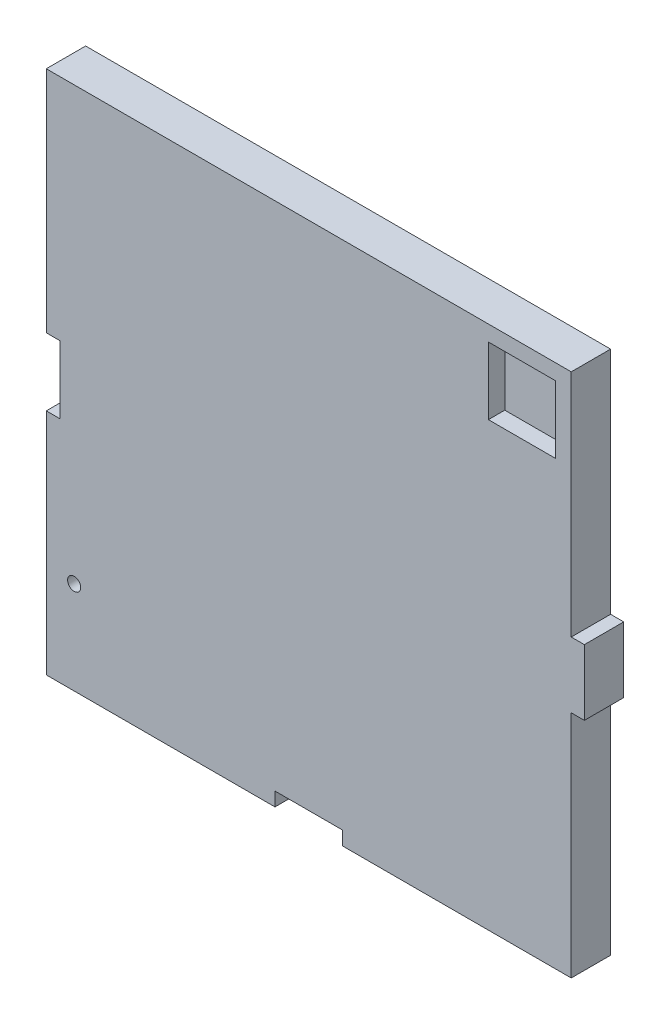
ISO-10303-21;
HEADER;
FILE_DESCRIPTION(('STEP AP214'),'2;1');
FILE_NAME('part.step','',(''),(''),'','','');
FILE_SCHEMA(('AUTOMOTIVE_DESIGN { 1 0 10303 214 1 1 1 1 }'));
ENDSEC;
DATA;
#1=APPLICATION_CONTEXT('core data for automotive mechanical design processes');
#2=APPLICATION_PROTOCOL_DEFINITION('international standard','automotive_design',2000,#1);
#3=PRODUCT_CONTEXT('',#1,'mechanical');
#4=PRODUCT('Part','Part','',(#3));
#5=PRODUCT_RELATED_PRODUCT_CATEGORY('part','',(#4));
#6=PRODUCT_DEFINITION_FORMATION('','',#4);
#7=PRODUCT_DEFINITION_CONTEXT('part definition',#1,'design');
#8=PRODUCT_DEFINITION('design','',#6,#7);
#9=PRODUCT_DEFINITION_SHAPE('','',#8);
#10=(LENGTH_UNIT() NAMED_UNIT(*) SI_UNIT(.MILLI.,.METRE.));
#11=(NAMED_UNIT(*) PLANE_ANGLE_UNIT() SI_UNIT($,.RADIAN.));
#12=(NAMED_UNIT(*) SI_UNIT($,.STERADIAN.) SOLID_ANGLE_UNIT());
#13=UNCERTAINTY_MEASURE_WITH_UNIT(LENGTH_MEASURE(1.E-05),#10,'distance_accuracy_value','');
#14=(GEOMETRIC_REPRESENTATION_CONTEXT(3) GLOBAL_UNCERTAINTY_ASSIGNED_CONTEXT((#13)) GLOBAL_UNIT_ASSIGNED_CONTEXT((#10,
#11,#12)) REPRESENTATION_CONTEXT('',''));
#15=CARTESIAN_POINT('',(0.,0.,0.));
#16=DIRECTION('',(0.,0.,1.));
#17=DIRECTION('',(1.,0.,0.));
#18=AXIS2_PLACEMENT_3D('',#15,#16,#17);
#19=CARTESIAN_POINT('',(8.50000000002301,28.2999999999935,12.));
#20=DIRECTION('',(0.,0.,-1.));
#21=DIRECTION('',(-1.,0.,0.));
#22=AXIS2_PLACEMENT_3D('',#19,#20,#21);
#23=CYLINDRICAL_SURFACE('',#22,2.);
#24=CARTESIAN_POINT('',(8.50000000002301,28.2999999999935,12.));
#25=DIRECTION('',(0.,0.,1.));
#26=DIRECTION('',(1.,0.,0.));
#27=AXIS2_PLACEMENT_3D('',#24,#25,#26);
#28=CIRCLE('',#27,2.);
#29=CARTESIAN_POINT('',(10.500000000023,28.2999999999935,12.));
#30=VERTEX_POINT('',#29);
#31=EDGE_CURVE('E205',#30,#30,#28,.T.);
#32=ORIENTED_EDGE('',*,*,#31,.T.);
#33=EDGE_LOOP('',(#32));
#34=FACE_BOUND('',#33,.T.);
#35=CARTESIAN_POINT('',(8.50000000002301,28.2999999999935,8.));
#36=DIRECTION('',(0.,0.,-1.));
#37=DIRECTION('',(-1.,0.,0.));
#38=AXIS2_PLACEMENT_3D('',#35,#36,#37);
#39=CIRCLE('',#38,2.);
#40=CARTESIAN_POINT('',(6.50000000002301,28.2999999999935,8.));
#41=VERTEX_POINT('',#40);
#42=EDGE_CURVE('E43',#41,#41,#39,.T.);
#43=ORIENTED_EDGE('',*,*,#42,.T.);
#44=EDGE_LOOP('',(#43));
#45=FACE_BOUND('',#44,.T.);
#46=ADVANCED_FACE('F39',(#34,#45),#23,.F.);
#47=CARTESIAN_POINT('',(0.,0.,12.));
#48=DIRECTION('',(0.,0.,1.));
#49=DIRECTION('',(1.,0.,0.));
#50=AXIS2_PLACEMENT_3D('',#47,#48,#49);
#51=PLANE('',#50);
#52=DIRECTION('',(0.,-1.,0.));
#53=VECTOR('',#52,1.);
#54=CARTESIAN_POINT('',(134.75,155.25,12.));
#55=LINE('',#54,#53);
#56=CARTESIAN_POINT('',(134.75,155.25,12.));
#57=VERTEX_POINT('',#56);
#58=CARTESIAN_POINT('',(134.75,134.75,12.));
#59=VERTEX_POINT('',#58);
#60=EDGE_CURVE('E54',#57,#59,#55,.T.);
#61=ORIENTED_EDGE('',*,*,#60,.F.);
#62=DIRECTION('',(-1.,0.,0.));
#63=VECTOR('',#62,1.);
#64=CARTESIAN_POINT('',(155.25,155.25,12.));
#65=LINE('',#64,#63);
#66=CARTESIAN_POINT('',(155.25,155.25,12.));
#67=VERTEX_POINT('',#66);
#68=EDGE_CURVE('E333',#67,#57,#65,.T.);
#69=ORIENTED_EDGE('',*,*,#68,.F.);
#70=DIRECTION('',(0.,1.,0.));
#71=VECTOR('',#70,1.);
#72=CARTESIAN_POINT('',(155.25,134.75,12.));
#73=LINE('',#72,#71);
#74=CARTESIAN_POINT('',(155.25,134.75,12.));
#75=VERTEX_POINT('',#74);
#76=EDGE_CURVE('E340',#75,#67,#73,.T.);
#77=ORIENTED_EDGE('',*,*,#76,.F.);
#78=DIRECTION('',(1.,0.,0.));
#79=VECTOR('',#78,1.);
#80=CARTESIAN_POINT('',(134.75,134.75,12.));
#81=LINE('',#80,#79);
#82=EDGE_CURVE('E344',#59,#75,#81,.T.);
#83=ORIENTED_EDGE('',*,*,#82,.F.);
#84=EDGE_LOOP('',(#61,#69,#77,#83));
#85=FACE_BOUND('',#84,.T.);
#86=DIRECTION('',(0.,-1.,0.));
#87=VECTOR('',#86,1.);
#88=CARTESIAN_POINT('',(0.,69.7,12.));
#89=LINE('',#88,#87);
#90=CARTESIAN_POINT('',(0.,69.7,12.));
#91=VERTEX_POINT('',#90);
#92=CARTESIAN_POINT('',(0.,0.,12.));
#93=VERTEX_POINT('',#92);
#94=EDGE_CURVE('E233',#91,#93,#89,.T.);
#95=ORIENTED_EDGE('',*,*,#94,.T.);
#96=DIRECTION('',(1.,0.,0.));
#97=VECTOR('',#96,1.);
#98=CARTESIAN_POINT('',(0.,0.,12.));
#99=LINE('',#98,#97);
#100=CARTESIAN_POINT('',(69.7,0.,12.));
#101=VERTEX_POINT('',#100);
#102=EDGE_CURVE('E129',#93,#101,#99,.T.);
#103=ORIENTED_EDGE('',*,*,#102,.T.);
#104=DIRECTION('',(0.,1.,0.));
#105=VECTOR('',#104,1.);
#106=CARTESIAN_POINT('',(69.7,0.,12.));
#107=LINE('',#106,#105);
#108=CARTESIAN_POINT('',(69.7,4.2,12.));
#109=VERTEX_POINT('',#108);
#110=EDGE_CURVE('E271',#101,#109,#107,.T.);
#111=ORIENTED_EDGE('',*,*,#110,.T.);
#112=DIRECTION('',(1.,0.,0.));
#113=VECTOR('',#112,1.);
#114=CARTESIAN_POINT('',(69.7,4.2,12.));
#115=LINE('',#114,#113);
#116=CARTESIAN_POINT('',(90.3,4.2,12.));
#117=VERTEX_POINT('',#116);
#118=EDGE_CURVE('E290',#109,#117,#115,.T.);
#119=ORIENTED_EDGE('',*,*,#118,.T.);
#120=DIRECTION('',(0.,-1.,0.));
#121=VECTOR('',#120,1.);
#122=CARTESIAN_POINT('',(90.3,4.2,12.));
#123=LINE('',#122,#121);
#124=CARTESIAN_POINT('',(90.3,0.,12.));
#125=VERTEX_POINT('',#124);
#126=EDGE_CURVE('E288',#117,#125,#123,.T.);
#127=ORIENTED_EDGE('',*,*,#126,.T.);
#128=DIRECTION('',(1.,0.,0.));
#129=VECTOR('',#128,1.);
#130=CARTESIAN_POINT('',(90.3,0.,12.));
#131=LINE('',#130,#129);
#132=CARTESIAN_POINT('',(160.,0.,12.));
#133=VERTEX_POINT('',#132);
#134=EDGE_CURVE('E287',#125,#133,#131,.T.);
#135=ORIENTED_EDGE('',*,*,#134,.T.);
#136=DIRECTION('',(0.,1.,0.));
#137=VECTOR('',#136,1.);
#138=CARTESIAN_POINT('',(160.,0.,12.));
#139=LINE('',#138,#137);
#140=CARTESIAN_POINT('',(160.,70.,12.));
#141=VERTEX_POINT('',#140);
#142=EDGE_CURVE('E292',#133,#141,#139,.T.);
#143=ORIENTED_EDGE('',*,*,#142,.T.);
#144=DIRECTION('',(1.,0.,0.));
#145=VECTOR('',#144,1.);
#146=CARTESIAN_POINT('',(160.,70.,12.));
#147=LINE('',#146,#145);
#148=CARTESIAN_POINT('',(164.,70.,12.));
#149=VERTEX_POINT('',#148);
#150=EDGE_CURVE('E299',#141,#149,#147,.T.);
#151=ORIENTED_EDGE('',*,*,#150,.T.);
#152=DIRECTION('',(0.,1.,0.));
#153=VECTOR('',#152,1.);
#154=CARTESIAN_POINT('',(164.,70.,12.));
#155=LINE('',#154,#153);
#156=CARTESIAN_POINT('',(164.,90.,12.));
#157=VERTEX_POINT('',#156);
#158=EDGE_CURVE('E300',#149,#157,#155,.T.);
#159=ORIENTED_EDGE('',*,*,#158,.T.);
#160=DIRECTION('',(-1.,0.,0.));
#161=VECTOR('',#160,1.);
#162=CARTESIAN_POINT('',(164.,90.,12.));
#163=LINE('',#162,#161);
#164=CARTESIAN_POINT('',(160.,90.,12.));
#165=VERTEX_POINT('',#164);
#166=EDGE_CURVE('E303',#157,#165,#163,.T.);
#167=ORIENTED_EDGE('',*,*,#166,.T.);
#168=DIRECTION('',(0.,1.,0.));
#169=VECTOR('',#168,1.);
#170=CARTESIAN_POINT('',(160.,90.,12.));
#171=LINE('',#170,#169);
#172=CARTESIAN_POINT('',(160.,160.,12.));
#173=VERTEX_POINT('',#172);
#174=EDGE_CURVE('E302',#165,#173,#171,.T.);
#175=ORIENTED_EDGE('',*,*,#174,.T.);
#176=DIRECTION('',(-1.,0.,0.));
#177=VECTOR('',#176,1.);
#178=CARTESIAN_POINT('',(160.,160.,12.));
#179=LINE('',#178,#177);
#180=CARTESIAN_POINT('',(0.,160.,12.));
#181=VERTEX_POINT('',#180);
#182=EDGE_CURVE('E301',#173,#181,#179,.T.);
#183=ORIENTED_EDGE('',*,*,#182,.T.);
#184=DIRECTION('',(0.,-1.,0.));
#185=VECTOR('',#184,1.);
#186=CARTESIAN_POINT('',(0.,160.,12.));
#187=LINE('',#186,#185);
#188=CARTESIAN_POINT('',(0.,90.3,12.));
#189=VERTEX_POINT('',#188);
#190=EDGE_CURVE('E179',#181,#189,#187,.T.);
#191=ORIENTED_EDGE('',*,*,#190,.T.);
#192=DIRECTION('',(1.,0.,0.));
#193=VECTOR('',#192,1.);
#194=CARTESIAN_POINT('',(0.,90.3,12.));
#195=LINE('',#194,#193);
#196=CARTESIAN_POINT('',(4.2,90.3,12.));
#197=VERTEX_POINT('',#196);
#198=EDGE_CURVE('E166',#189,#197,#195,.T.);
#199=ORIENTED_EDGE('',*,*,#198,.T.);
#200=DIRECTION('',(0.,-1.,0.));
#201=VECTOR('',#200,1.);
#202=CARTESIAN_POINT('',(4.2,90.3,12.));
#203=LINE('',#202,#201);
#204=CARTESIAN_POINT('',(4.2,69.7,12.));
#205=VERTEX_POINT('',#204);
#206=EDGE_CURVE('E175',#197,#205,#203,.T.);
#207=ORIENTED_EDGE('',*,*,#206,.T.);
#208=DIRECTION('',(-1.,0.,0.));
#209=VECTOR('',#208,1.);
#210=CARTESIAN_POINT('',(4.2,69.7,12.));
#211=LINE('',#210,#209);
#212=EDGE_CURVE('E65',#205,#91,#211,.T.);
#213=ORIENTED_EDGE('',*,*,#212,.T.);
#214=EDGE_LOOP('',(#95,#103,#111,#119,#127,#135,#143,#151,#159,#167,#175,#183,#191,#199,#207,#213));
#215=FACE_BOUND('',#214,.T.);
#216=ORIENTED_EDGE('',*,*,#31,.F.);
#217=EDGE_LOOP('',(#216));
#218=FACE_BOUND('',#217,.T.);
#219=ADVANCED_FACE('F173',(#85,#215,#218),#51,.T.);
#220=CARTESIAN_POINT('',(0.,0.,0.));
#221=DIRECTION('',(0.,0.,1.));
#222=DIRECTION('',(1.,0.,0.));
#223=AXIS2_PLACEMENT_3D('',#220,#221,#222);
#224=PLANE('',#223);
#225=CARTESIAN_POINT('',(8.50000000002301,28.2999999999935,0.));
#226=DIRECTION('',(0.,0.,-1.));
#227=DIRECTION('',(-1.,0.,0.));
#228=AXIS2_PLACEMENT_3D('',#225,#226,#227);
#229=CIRCLE('',#228,3.45);
#230=CARTESIAN_POINT('',(5.05000000002301,28.2999999999935,0.));
#231=VERTEX_POINT('',#230);
#232=EDGE_CURVE('E358',#231,#231,#229,.T.);
#233=ORIENTED_EDGE('',*,*,#232,.F.);
#234=EDGE_LOOP('',(#233));
#235=FACE_BOUND('',#234,.T.);
#236=DIRECTION('',(0.,-1.,0.));
#237=VECTOR('',#236,1.);
#238=CARTESIAN_POINT('',(0.,69.7,0.));
#239=LINE('',#238,#237);
#240=CARTESIAN_POINT('',(0.,69.7,0.));
#241=VERTEX_POINT('',#240);
#242=CARTESIAN_POINT('',(0.,0.,0.));
#243=VERTEX_POINT('',#242);
#244=EDGE_CURVE('E196',#241,#243,#239,.T.);
#245=ORIENTED_EDGE('',*,*,#244,.F.);
#246=DIRECTION('',(-1.,0.,0.));
#247=VECTOR('',#246,1.);
#248=CARTESIAN_POINT('',(4.2,69.7,0.));
#249=LINE('',#248,#247);
#250=CARTESIAN_POINT('',(4.2,69.7,0.));
#251=VERTEX_POINT('',#250);
#252=EDGE_CURVE('E123',#251,#241,#249,.T.);
#253=ORIENTED_EDGE('',*,*,#252,.F.);
#254=DIRECTION('',(0.,-1.,0.));
#255=VECTOR('',#254,1.);
#256=CARTESIAN_POINT('',(4.2,90.3,0.));
#257=LINE('',#256,#255);
#258=CARTESIAN_POINT('',(4.2,90.3,0.));
#259=VERTEX_POINT('',#258);
#260=EDGE_CURVE('E227',#259,#251,#257,.T.);
#261=ORIENTED_EDGE('',*,*,#260,.F.);
#262=DIRECTION('',(1.,0.,0.));
#263=VECTOR('',#262,1.);
#264=CARTESIAN_POINT('',(0.,90.3,0.));
#265=LINE('',#264,#263);
#266=CARTESIAN_POINT('',(0.,90.3,0.));
#267=VERTEX_POINT('',#266);
#268=EDGE_CURVE('E188',#267,#259,#265,.T.);
#269=ORIENTED_EDGE('',*,*,#268,.F.);
#270=DIRECTION('',(0.,-1.,0.));
#271=VECTOR('',#270,1.);
#272=CARTESIAN_POINT('',(0.,160.,0.));
#273=LINE('',#272,#271);
#274=CARTESIAN_POINT('',(0.,160.,0.));
#275=VERTEX_POINT('',#274);
#276=EDGE_CURVE('E223',#275,#267,#273,.T.);
#277=ORIENTED_EDGE('',*,*,#276,.F.);
#278=DIRECTION('',(-1.,0.,0.));
#279=VECTOR('',#278,1.);
#280=CARTESIAN_POINT('',(70.,160.,0.));
#281=LINE('',#280,#279);
#282=CARTESIAN_POINT('',(160.,160.,0.));
#283=VERTEX_POINT('',#282);
#284=EDGE_CURVE('E224',#283,#275,#281,.T.);
#285=ORIENTED_EDGE('',*,*,#284,.F.);
#286=DIRECTION('',(0.,1.,0.));
#287=VECTOR('',#286,1.);
#288=CARTESIAN_POINT('',(160.,90.,0.));
#289=LINE('',#288,#287);
#290=CARTESIAN_POINT('',(160.,90.,0.));
#291=VERTEX_POINT('',#290);
#292=EDGE_CURVE('E219',#291,#283,#289,.T.);
#293=ORIENTED_EDGE('',*,*,#292,.F.);
#294=DIRECTION('',(-1.,0.,0.));
#295=VECTOR('',#294,1.);
#296=CARTESIAN_POINT('',(164.,90.,0.));
#297=LINE('',#296,#295);
#298=CARTESIAN_POINT('',(164.,90.,0.));
#299=VERTEX_POINT('',#298);
#300=EDGE_CURVE('E217',#299,#291,#297,.T.);
#301=ORIENTED_EDGE('',*,*,#300,.F.);
#302=DIRECTION('',(0.,1.,0.));
#303=VECTOR('',#302,1.);
#304=CARTESIAN_POINT('',(164.,70.,0.));
#305=LINE('',#304,#303);
#306=CARTESIAN_POINT('',(164.,70.,0.));
#307=VERTEX_POINT('',#306);
#308=EDGE_CURVE('E216',#307,#299,#305,.T.);
#309=ORIENTED_EDGE('',*,*,#308,.F.);
#310=DIRECTION('',(1.,0.,0.));
#311=VECTOR('',#310,1.);
#312=CARTESIAN_POINT('',(160.,70.,0.));
#313=LINE('',#312,#311);
#314=CARTESIAN_POINT('',(160.,70.,0.));
#315=VERTEX_POINT('',#314);
#316=EDGE_CURVE('E212',#315,#307,#313,.T.);
#317=ORIENTED_EDGE('',*,*,#316,.F.);
#318=DIRECTION('',(0.,1.,0.));
#319=VECTOR('',#318,1.);
#320=CARTESIAN_POINT('',(160.,0.,0.));
#321=LINE('',#320,#319);
#322=CARTESIAN_POINT('',(160.,0.,0.));
#323=VERTEX_POINT('',#322);
#324=EDGE_CURVE('E215',#323,#315,#321,.T.);
#325=ORIENTED_EDGE('',*,*,#324,.F.);
#326=DIRECTION('',(1.,0.,0.));
#327=VECTOR('',#326,1.);
#328=CARTESIAN_POINT('',(90.3,0.,0.));
#329=LINE('',#328,#327);
#330=CARTESIAN_POINT('',(90.3,0.,0.));
#331=VERTEX_POINT('',#330);
#332=EDGE_CURVE('E209',#331,#323,#329,.T.);
#333=ORIENTED_EDGE('',*,*,#332,.F.);
#334=DIRECTION('',(0.,-1.,0.));
#335=VECTOR('',#334,1.);
#336=CARTESIAN_POINT('',(90.3,4.2,0.));
#337=LINE('',#336,#335);
#338=CARTESIAN_POINT('',(90.3,4.2,0.));
#339=VERTEX_POINT('',#338);
#340=EDGE_CURVE('E208',#339,#331,#337,.T.);
#341=ORIENTED_EDGE('',*,*,#340,.F.);
#342=DIRECTION('',(1.,0.,0.));
#343=VECTOR('',#342,1.);
#344=CARTESIAN_POINT('',(69.7,4.2,0.));
#345=LINE('',#344,#343);
#346=CARTESIAN_POINT('',(69.7,4.2,0.));
#347=VERTEX_POINT('',#346);
#348=EDGE_CURVE('E206',#347,#339,#345,.T.);
#349=ORIENTED_EDGE('',*,*,#348,.F.);
#350=DIRECTION('',(0.,1.,0.));
#351=VECTOR('',#350,1.);
#352=CARTESIAN_POINT('',(69.7,0.,0.));
#353=LINE('',#352,#351);
#354=CARTESIAN_POINT('',(69.7,0.,0.));
#355=VERTEX_POINT('',#354);
#356=EDGE_CURVE('E204',#355,#347,#353,.T.);
#357=ORIENTED_EDGE('',*,*,#356,.F.);
#358=DIRECTION('',(1.,0.,0.));
#359=VECTOR('',#358,1.);
#360=CARTESIAN_POINT('',(0.,0.,0.));
#361=LINE('',#360,#359);
#362=EDGE_CURVE('E203',#243,#355,#361,.T.);
#363=ORIENTED_EDGE('',*,*,#362,.F.);
#364=EDGE_LOOP('',(#245,#253,#261,#269,#277,#285,#293,#301,#309,#317,#325,#333,#341,#349,#357,#363));
#365=FACE_BOUND('',#364,.T.);
#366=ADVANCED_FACE('F274',(#235,#365),#224,.F.);
#367=CARTESIAN_POINT('',(0.,69.7,12.));
#368=DIRECTION('',(1.,0.,0.));
#369=DIRECTION('',(0.,0.,-1.));
#370=AXIS2_PLACEMENT_3D('',#367,#368,#369);
#371=PLANE('',#370);
#372=ORIENTED_EDGE('',*,*,#244,.T.);
#373=DIRECTION('',(0.,0.,-1.));
#374=VECTOR('',#373,1.);
#375=CARTESIAN_POINT('',(0.,0.,12.));
#376=LINE('',#375,#374);
#377=EDGE_CURVE('E11',#93,#243,#376,.T.);
#378=ORIENTED_EDGE('',*,*,#377,.F.);
#379=ORIENTED_EDGE('',*,*,#94,.F.);
#380=DIRECTION('',(0.,0.,-1.));
#381=VECTOR('',#380,1.);
#382=CARTESIAN_POINT('',(0.,69.7,12.));
#383=LINE('',#382,#381);
#384=EDGE_CURVE('E195',#91,#241,#383,.T.);
#385=ORIENTED_EDGE('',*,*,#384,.T.);
#386=EDGE_LOOP('',(#372,#378,#379,#385));
#387=FACE_BOUND('',#386,.T.);
#388=ADVANCED_FACE('F41',(#387),#371,.F.);
#389=CARTESIAN_POINT('',(0.,0.,12.));
#390=DIRECTION('',(0.,1.,0.));
#391=DIRECTION('',(0.,0.,1.));
#392=AXIS2_PLACEMENT_3D('',#389,#390,#391);
#393=PLANE('',#392);
#394=ORIENTED_EDGE('',*,*,#362,.T.);
#395=DIRECTION('',(0.,0.,-1.));
#396=VECTOR('',#395,1.);
#397=CARTESIAN_POINT('',(69.7,0.,12.));
#398=LINE('',#397,#396);
#399=EDGE_CURVE('E48',#101,#355,#398,.T.);
#400=ORIENTED_EDGE('',*,*,#399,.F.);
#401=ORIENTED_EDGE('',*,*,#102,.F.);
#402=ORIENTED_EDGE('',*,*,#377,.T.);
#403=EDGE_LOOP('',(#394,#400,#401,#402));
#404=FACE_BOUND('',#403,.T.);
#405=ADVANCED_FACE('F435',(#404),#393,.F.);
#406=CARTESIAN_POINT('',(69.7,0.,12.));
#407=DIRECTION('',(-1.,0.,0.));
#408=DIRECTION('',(0.,0.,1.));
#409=AXIS2_PLACEMENT_3D('',#406,#407,#408);
#410=PLANE('',#409);
#411=ORIENTED_EDGE('',*,*,#356,.T.);
#412=DIRECTION('',(0.,0.,-1.));
#413=VECTOR('',#412,1.);
#414=CARTESIAN_POINT('',(69.7,4.2,12.));
#415=LINE('',#414,#413);
#416=EDGE_CURVE('E265',#109,#347,#415,.T.);
#417=ORIENTED_EDGE('',*,*,#416,.F.);
#418=ORIENTED_EDGE('',*,*,#110,.F.);
#419=ORIENTED_EDGE('',*,*,#399,.T.);
#420=EDGE_LOOP('',(#411,#417,#418,#419));
#421=FACE_BOUND('',#420,.T.);
#422=ADVANCED_FACE('F267',(#421),#410,.F.);
#423=CARTESIAN_POINT('',(69.7,4.2,12.));
#424=DIRECTION('',(0.,1.,0.));
#425=DIRECTION('',(0.,0.,1.));
#426=AXIS2_PLACEMENT_3D('',#423,#424,#425);
#427=PLANE('',#426);
#428=ORIENTED_EDGE('',*,*,#348,.T.);
#429=DIRECTION('',(0.,0.,-1.));
#430=VECTOR('',#429,1.);
#431=CARTESIAN_POINT('',(90.3,4.2,12.));
#432=LINE('',#431,#430);
#433=EDGE_CURVE('E259',#117,#339,#432,.T.);
#434=ORIENTED_EDGE('',*,*,#433,.F.);
#435=ORIENTED_EDGE('',*,*,#118,.F.);
#436=ORIENTED_EDGE('',*,*,#416,.T.);
#437=EDGE_LOOP('',(#428,#434,#435,#436));
#438=FACE_BOUND('',#437,.T.);
#439=ADVANCED_FACE('F278',(#438),#427,.F.);
#440=CARTESIAN_POINT('',(90.3,4.2,12.));
#441=DIRECTION('',(1.,0.,0.));
#442=DIRECTION('',(0.,0.,-1.));
#443=AXIS2_PLACEMENT_3D('',#440,#441,#442);
#444=PLANE('',#443);
#445=ORIENTED_EDGE('',*,*,#340,.T.);
#446=DIRECTION('',(0.,0.,-1.));
#447=VECTOR('',#446,1.);
#448=CARTESIAN_POINT('',(90.3,0.,12.));
#449=LINE('',#448,#447);
#450=EDGE_CURVE('E258',#125,#331,#449,.T.);
#451=ORIENTED_EDGE('',*,*,#450,.F.);
#452=ORIENTED_EDGE('',*,*,#126,.F.);
#453=ORIENTED_EDGE('',*,*,#433,.T.);
#454=EDGE_LOOP('',(#445,#451,#452,#453));
#455=FACE_BOUND('',#454,.T.);
#456=ADVANCED_FACE('F285',(#455),#444,.F.);
#457=CARTESIAN_POINT('',(90.3,0.,12.));
#458=DIRECTION('',(0.,1.,0.));
#459=DIRECTION('',(0.,0.,1.));
#460=AXIS2_PLACEMENT_3D('',#457,#458,#459);
#461=PLANE('',#460);
#462=ORIENTED_EDGE('',*,*,#332,.T.);
#463=DIRECTION('',(0.,0.,-1.));
#464=VECTOR('',#463,1.);
#465=CARTESIAN_POINT('',(160.,0.,12.));
#466=LINE('',#465,#464);
#467=EDGE_CURVE('E251',#133,#323,#466,.T.);
#468=ORIENTED_EDGE('',*,*,#467,.F.);
#469=ORIENTED_EDGE('',*,*,#134,.F.);
#470=ORIENTED_EDGE('',*,*,#450,.T.);
#471=EDGE_LOOP('',(#462,#468,#469,#470));
#472=FACE_BOUND('',#471,.T.);
#473=ADVANCED_FACE('F425',(#472),#461,.F.);
#474=CARTESIAN_POINT('',(160.,0.,12.));
#475=DIRECTION('',(-1.,0.,0.));
#476=DIRECTION('',(0.,0.,1.));
#477=AXIS2_PLACEMENT_3D('',#474,#475,#476);
#478=PLANE('',#477);
#479=ORIENTED_EDGE('',*,*,#324,.T.);
#480=DIRECTION('',(0.,0.,-1.));
#481=VECTOR('',#480,1.);
#482=CARTESIAN_POINT('',(160.,70.,12.));
#483=LINE('',#482,#481);
#484=EDGE_CURVE('E246',#141,#315,#483,.T.);
#485=ORIENTED_EDGE('',*,*,#484,.F.);
#486=ORIENTED_EDGE('',*,*,#142,.F.);
#487=ORIENTED_EDGE('',*,*,#467,.T.);
#488=EDGE_LOOP('',(#479,#485,#486,#487));
#489=FACE_BOUND('',#488,.T.);
#490=ADVANCED_FACE('F416',(#489),#478,.F.);
#491=CARTESIAN_POINT('',(160.,70.,12.));
#492=DIRECTION('',(0.,1.,0.));
#493=DIRECTION('',(0.,0.,1.));
#494=AXIS2_PLACEMENT_3D('',#491,#492,#493);
#495=PLANE('',#494);
#496=ORIENTED_EDGE('',*,*,#316,.T.);
#497=DIRECTION('',(0.,0.,-1.));
#498=VECTOR('',#497,1.);
#499=CARTESIAN_POINT('',(164.,70.,12.));
#500=LINE('',#499,#498);
#501=EDGE_CURVE('E249',#149,#307,#500,.T.);
#502=ORIENTED_EDGE('',*,*,#501,.F.);
#503=ORIENTED_EDGE('',*,*,#150,.F.);
#504=ORIENTED_EDGE('',*,*,#484,.T.);
#505=EDGE_LOOP('',(#496,#502,#503,#504));
#506=FACE_BOUND('',#505,.T.);
#507=ADVANCED_FACE('F415',(#506),#495,.F.);
#508=CARTESIAN_POINT('',(164.,70.,12.));
#509=DIRECTION('',(-1.,0.,0.));
#510=DIRECTION('',(0.,0.,1.));
#511=AXIS2_PLACEMENT_3D('',#508,#509,#510);
#512=PLANE('',#511);
#513=ORIENTED_EDGE('',*,*,#308,.T.);
#514=DIRECTION('',(0.,0.,-1.));
#515=VECTOR('',#514,1.);
#516=CARTESIAN_POINT('',(164.,90.,12.));
#517=LINE('',#516,#515);
#518=EDGE_CURVE('E245',#157,#299,#517,.T.);
#519=ORIENTED_EDGE('',*,*,#518,.F.);
#520=ORIENTED_EDGE('',*,*,#158,.F.);
#521=ORIENTED_EDGE('',*,*,#501,.T.);
#522=EDGE_LOOP('',(#513,#519,#520,#521));
#523=FACE_BOUND('',#522,.T.);
#524=ADVANCED_FACE('F406',(#523),#512,.F.);
#525=CARTESIAN_POINT('',(164.,90.,12.));
#526=DIRECTION('',(0.,-1.,0.));
#527=DIRECTION('',(0.,0.,-1.));
#528=AXIS2_PLACEMENT_3D('',#525,#526,#527);
#529=PLANE('',#528);
#530=ORIENTED_EDGE('',*,*,#300,.T.);
#531=DIRECTION('',(0.,0.,-1.));
#532=VECTOR('',#531,1.);
#533=CARTESIAN_POINT('',(160.,90.,12.));
#534=LINE('',#533,#532);
#535=EDGE_CURVE('E243',#165,#291,#534,.T.);
#536=ORIENTED_EDGE('',*,*,#535,.F.);
#537=ORIENTED_EDGE('',*,*,#166,.F.);
#538=ORIENTED_EDGE('',*,*,#518,.T.);
#539=EDGE_LOOP('',(#530,#536,#537,#538));
#540=FACE_BOUND('',#539,.T.);
#541=ADVANCED_FACE('F408',(#540),#529,.F.);
#542=CARTESIAN_POINT('',(160.,90.,12.));
#543=DIRECTION('',(-1.,0.,0.));
#544=DIRECTION('',(0.,0.,1.));
#545=AXIS2_PLACEMENT_3D('',#542,#543,#544);
#546=PLANE('',#545);
#547=ORIENTED_EDGE('',*,*,#292,.T.);
#548=DIRECTION('',(0.,0.,-1.));
#549=VECTOR('',#548,1.);
#550=CARTESIAN_POINT('',(160.,160.,12.));
#551=LINE('',#550,#549);
#552=EDGE_CURVE('E236',#173,#283,#551,.T.);
#553=ORIENTED_EDGE('',*,*,#552,.F.);
#554=ORIENTED_EDGE('',*,*,#174,.F.);
#555=ORIENTED_EDGE('',*,*,#535,.T.);
#556=EDGE_LOOP('',(#547,#553,#554,#555));
#557=FACE_BOUND('',#556,.T.);
#558=ADVANCED_FACE('F401',(#557),#546,.F.);
#559=CARTESIAN_POINT('',(70.,160.,12.));
#560=DIRECTION('',(0.,-1.,0.));
#561=DIRECTION('',(0.,0.,-1.));
#562=AXIS2_PLACEMENT_3D('',#559,#560,#561);
#563=PLANE('',#562);
#564=ORIENTED_EDGE('',*,*,#284,.T.);
#565=DIRECTION('',(0.,0.,-1.));
#566=VECTOR('',#565,1.);
#567=CARTESIAN_POINT('',(0.,160.,12.));
#568=LINE('',#567,#566);
#569=EDGE_CURVE('E231',#181,#275,#568,.T.);
#570=ORIENTED_EDGE('',*,*,#569,.F.);
#571=ORIENTED_EDGE('',*,*,#182,.F.);
#572=ORIENTED_EDGE('',*,*,#552,.T.);
#573=EDGE_LOOP('',(#564,#570,#571,#572));
#574=FACE_BOUND('',#573,.T.);
#575=ADVANCED_FACE('F313',(#574),#563,.F.);
#576=CARTESIAN_POINT('',(0.,160.,12.));
#577=DIRECTION('',(1.,0.,0.));
#578=DIRECTION('',(0.,0.,-1.));
#579=AXIS2_PLACEMENT_3D('',#576,#577,#578);
#580=PLANE('',#579);
#581=ORIENTED_EDGE('',*,*,#276,.T.);
#582=DIRECTION('',(0.,0.,-1.));
#583=VECTOR('',#582,1.);
#584=CARTESIAN_POINT('',(0.,90.3,12.));
#585=LINE('',#584,#583);
#586=EDGE_CURVE('E190',#189,#267,#585,.T.);
#587=ORIENTED_EDGE('',*,*,#586,.F.);
#588=ORIENTED_EDGE('',*,*,#190,.F.);
#589=ORIENTED_EDGE('',*,*,#569,.T.);
#590=EDGE_LOOP('',(#581,#587,#588,#589));
#591=FACE_BOUND('',#590,.T.);
#592=ADVANCED_FACE('F314',(#591),#580,.F.);
#593=CARTESIAN_POINT('',(0.,90.3,12.));
#594=DIRECTION('',(0.,1.,0.));
#595=DIRECTION('',(0.,0.,1.));
#596=AXIS2_PLACEMENT_3D('',#593,#594,#595);
#597=PLANE('',#596);
#598=ORIENTED_EDGE('',*,*,#268,.T.);
#599=DIRECTION('',(0.,0.,-1.));
#600=VECTOR('',#599,1.);
#601=CARTESIAN_POINT('',(4.2,90.3,12.));
#602=LINE('',#601,#600);
#603=EDGE_CURVE('E181',#197,#259,#602,.T.);
#604=ORIENTED_EDGE('',*,*,#603,.F.);
#605=ORIENTED_EDGE('',*,*,#198,.F.);
#606=ORIENTED_EDGE('',*,*,#586,.T.);
#607=EDGE_LOOP('',(#598,#604,#605,#606));
#608=FACE_BOUND('',#607,.T.);
#609=ADVANCED_FACE('F184',(#608),#597,.F.);
#610=CARTESIAN_POINT('',(4.2,90.3,12.));
#611=DIRECTION('',(1.,0.,0.));
#612=DIRECTION('',(0.,0.,-1.));
#613=AXIS2_PLACEMENT_3D('',#610,#611,#612);
#614=PLANE('',#613);
#615=ORIENTED_EDGE('',*,*,#260,.T.);
#616=DIRECTION('',(0.,0.,-1.));
#617=VECTOR('',#616,1.);
#618=CARTESIAN_POINT('',(4.2,69.7,12.));
#619=LINE('',#618,#617);
#620=EDGE_CURVE('E186',#205,#251,#619,.T.);
#621=ORIENTED_EDGE('',*,*,#620,.F.);
#622=ORIENTED_EDGE('',*,*,#206,.F.);
#623=ORIENTED_EDGE('',*,*,#603,.T.);
#624=EDGE_LOOP('',(#615,#621,#622,#623));
#625=FACE_BOUND('',#624,.T.);
#626=ADVANCED_FACE('F194',(#625),#614,.F.);
#627=CARTESIAN_POINT('',(4.2,69.7,12.));
#628=DIRECTION('',(0.,-1.,0.));
#629=DIRECTION('',(0.,0.,-1.));
#630=AXIS2_PLACEMENT_3D('',#627,#628,#629);
#631=PLANE('',#630);
#632=ORIENTED_EDGE('',*,*,#252,.T.);
#633=ORIENTED_EDGE('',*,*,#384,.F.);
#634=ORIENTED_EDGE('',*,*,#212,.F.);
#635=ORIENTED_EDGE('',*,*,#620,.T.);
#636=EDGE_LOOP('',(#632,#633,#634,#635));
#637=FACE_BOUND('',#636,.T.);
#638=ADVANCED_FACE('F312',(#637),#631,.F.);
#639=CARTESIAN_POINT('',(134.75,155.25,7.));
#640=DIRECTION('',(-1.,0.,0.));
#641=DIRECTION('',(0.,0.,1.));
#642=AXIS2_PLACEMENT_3D('',#639,#640,#641);
#643=PLANE('',#642);
#644=ORIENTED_EDGE('',*,*,#60,.T.);
#645=DIRECTION('',(0.,0.,1.));
#646=VECTOR('',#645,1.);
#647=CARTESIAN_POINT('',(134.75,134.75,7.));
#648=LINE('',#647,#646);
#649=CARTESIAN_POINT('',(134.75,134.75,7.));
#650=VERTEX_POINT('',#649);
#651=EDGE_CURVE('E324',#650,#59,#648,.T.);
#652=ORIENTED_EDGE('',*,*,#651,.F.);
#653=DIRECTION('',(0.,-1.,0.));
#654=VECTOR('',#653,1.);
#655=CARTESIAN_POINT('',(134.75,155.25,7.));
#656=LINE('',#655,#654);
#657=CARTESIAN_POINT('',(134.75,155.25,7.));
#658=VERTEX_POINT('',#657);
#659=EDGE_CURVE('E337',#658,#650,#656,.T.);
#660=ORIENTED_EDGE('',*,*,#659,.F.);
#661=DIRECTION('',(0.,0.,1.));
#662=VECTOR('',#661,1.);
#663=CARTESIAN_POINT('',(134.75,155.25,7.));
#664=LINE('',#663,#662);
#665=EDGE_CURVE('E322',#658,#57,#664,.T.);
#666=ORIENTED_EDGE('',*,*,#665,.T.);
#667=EDGE_LOOP('',(#644,#652,#660,#666));
#668=FACE_BOUND('',#667,.T.);
#669=ADVANCED_FACE('F389',(#668),#643,.F.);
#670=CARTESIAN_POINT('',(155.25,155.25,7.));
#671=DIRECTION('',(0.,1.,0.));
#672=DIRECTION('',(0.,0.,1.));
#673=AXIS2_PLACEMENT_3D('',#670,#671,#672);
#674=PLANE('',#673);
#675=ORIENTED_EDGE('',*,*,#68,.T.);
#676=ORIENTED_EDGE('',*,*,#665,.F.);
#677=DIRECTION('',(-1.,0.,0.));
#678=VECTOR('',#677,1.);
#679=CARTESIAN_POINT('',(155.25,155.25,7.));
#680=LINE('',#679,#678);
#681=CARTESIAN_POINT('',(155.25,155.25,7.));
#682=VERTEX_POINT('',#681);
#683=EDGE_CURVE('E327',#682,#658,#680,.T.);
#684=ORIENTED_EDGE('',*,*,#683,.F.);
#685=DIRECTION('',(0.,0.,1.));
#686=VECTOR('',#685,1.);
#687=CARTESIAN_POINT('',(155.25,155.25,7.));
#688=LINE('',#687,#686);
#689=EDGE_CURVE('E332',#682,#67,#688,.T.);
#690=ORIENTED_EDGE('',*,*,#689,.T.);
#691=EDGE_LOOP('',(#675,#676,#684,#690));
#692=FACE_BOUND('',#691,.T.);
#693=ADVANCED_FACE('F547',(#692),#674,.F.);
#694=CARTESIAN_POINT('',(155.25,134.75,7.));
#695=DIRECTION('',(1.,0.,0.));
#696=DIRECTION('',(0.,0.,-1.));
#697=AXIS2_PLACEMENT_3D('',#694,#695,#696);
#698=PLANE('',#697);
#699=ORIENTED_EDGE('',*,*,#76,.T.);
#700=ORIENTED_EDGE('',*,*,#689,.F.);
#701=DIRECTION('',(0.,1.,0.));
#702=VECTOR('',#701,1.);
#703=CARTESIAN_POINT('',(155.25,134.75,7.));
#704=LINE('',#703,#702);
#705=CARTESIAN_POINT('',(155.25,134.75,7.));
#706=VERTEX_POINT('',#705);
#707=EDGE_CURVE('E346',#706,#682,#704,.T.);
#708=ORIENTED_EDGE('',*,*,#707,.F.);
#709=DIRECTION('',(0.,0.,1.));
#710=VECTOR('',#709,1.);
#711=CARTESIAN_POINT('',(155.25,134.75,7.));
#712=LINE('',#711,#710);
#713=EDGE_CURVE('E330',#706,#75,#712,.T.);
#714=ORIENTED_EDGE('',*,*,#713,.T.);
#715=EDGE_LOOP('',(#699,#700,#708,#714));
#716=FACE_BOUND('',#715,.T.);
#717=ADVANCED_FACE('F558',(#716),#698,.F.);
#718=CARTESIAN_POINT('',(134.75,134.75,7.));
#719=DIRECTION('',(0.,-1.,0.));
#720=DIRECTION('',(0.,0.,-1.));
#721=AXIS2_PLACEMENT_3D('',#718,#719,#720);
#722=PLANE('',#721);
#723=ORIENTED_EDGE('',*,*,#82,.T.);
#724=ORIENTED_EDGE('',*,*,#713,.F.);
#725=DIRECTION('',(1.,0.,0.));
#726=VECTOR('',#725,1.);
#727=CARTESIAN_POINT('',(134.75,134.75,7.));
#728=LINE('',#727,#726);
#729=EDGE_CURVE('E353',#650,#706,#728,.T.);
#730=ORIENTED_EDGE('',*,*,#729,.F.);
#731=ORIENTED_EDGE('',*,*,#651,.T.);
#732=EDGE_LOOP('',(#723,#724,#730,#731));
#733=FACE_BOUND('',#732,.T.);
#734=ADVANCED_FACE('F567',(#733),#722,.F.);
#735=CARTESIAN_POINT('',(0.,0.,7.));
#736=DIRECTION('',(0.,0.,1.));
#737=DIRECTION('',(1.,0.,0.));
#738=AXIS2_PLACEMENT_3D('',#735,#736,#737);
#739=PLANE('',#738);
#740=ORIENTED_EDGE('',*,*,#659,.T.);
#741=ORIENTED_EDGE('',*,*,#729,.T.);
#742=ORIENTED_EDGE('',*,*,#707,.T.);
#743=ORIENTED_EDGE('',*,*,#683,.T.);
#744=EDGE_LOOP('',(#740,#741,#742,#743));
#745=FACE_BOUND('',#744,.T.);
#746=ADVANCED_FACE('F372',(#745),#739,.T.);
#747=CARTESIAN_POINT('',(8.50000000002301,28.2999999999935,8.));
#748=DIRECTION('',(0.,0.,-1.));
#749=DIRECTION('',(-1.,0.,0.));
#750=AXIS2_PLACEMENT_3D('',#747,#748,#749);
#751=CYLINDRICAL_SURFACE('',#750,3.45);
#752=CARTESIAN_POINT('',(8.50000000002301,28.2999999999935,8.));
#753=DIRECTION('',(0.,0.,-1.));
#754=DIRECTION('',(-1.,0.,0.));
#755=AXIS2_PLACEMENT_3D('',#752,#753,#754);
#756=CIRCLE('',#755,3.45);
#757=CARTESIAN_POINT('',(5.05000000002301,28.2999999999935,8.));
#758=VERTEX_POINT('',#757);
#759=EDGE_CURVE('E360',#758,#758,#756,.T.);
#760=ORIENTED_EDGE('',*,*,#759,.F.);
#761=EDGE_LOOP('',(#760));
#762=FACE_BOUND('',#761,.T.);
#763=ORIENTED_EDGE('',*,*,#232,.T.);
#764=EDGE_LOOP('',(#763));
#765=FACE_BOUND('',#764,.T.);
#766=ADVANCED_FACE('F369',(#762,#765),#751,.F.);
#767=CARTESIAN_POINT('',(8.50000000002301,28.2999999999935,8.));
#768=DIRECTION('',(0.,0.,-1.));
#769=DIRECTION('',(-1.,0.,0.));
#770=AXIS2_PLACEMENT_3D('',#767,#768,#769);
#771=PLANE('',#770);
#772=ORIENTED_EDGE('',*,*,#42,.F.);
#773=EDGE_LOOP('',(#772));
#774=FACE_BOUND('',#773,.T.);
#775=ORIENTED_EDGE('',*,*,#759,.T.);
#776=EDGE_LOOP('',(#775));
#777=FACE_BOUND('',#776,.T.);
#778=ADVANCED_FACE('F370',(#774,#777),#771,.T.);
#779=CLOSED_SHELL('',(#46,#219,#366,#388,#405,#422,#439,#456,#473,#490,#507,#524,#541,#558,#575,
#592,#609,#626,#638,#669,#693,#717,#734,#746,#766,#778));
#780=MANIFOLD_SOLID_BREP('B2',#779);
#781=ADVANCED_BREP_SHAPE_REPRESENTATION('',(#18,#780),#14);
#782=SHAPE_DEFINITION_REPRESENTATION(#9,#781);
ENDSEC;
END-ISO-10303-21;
